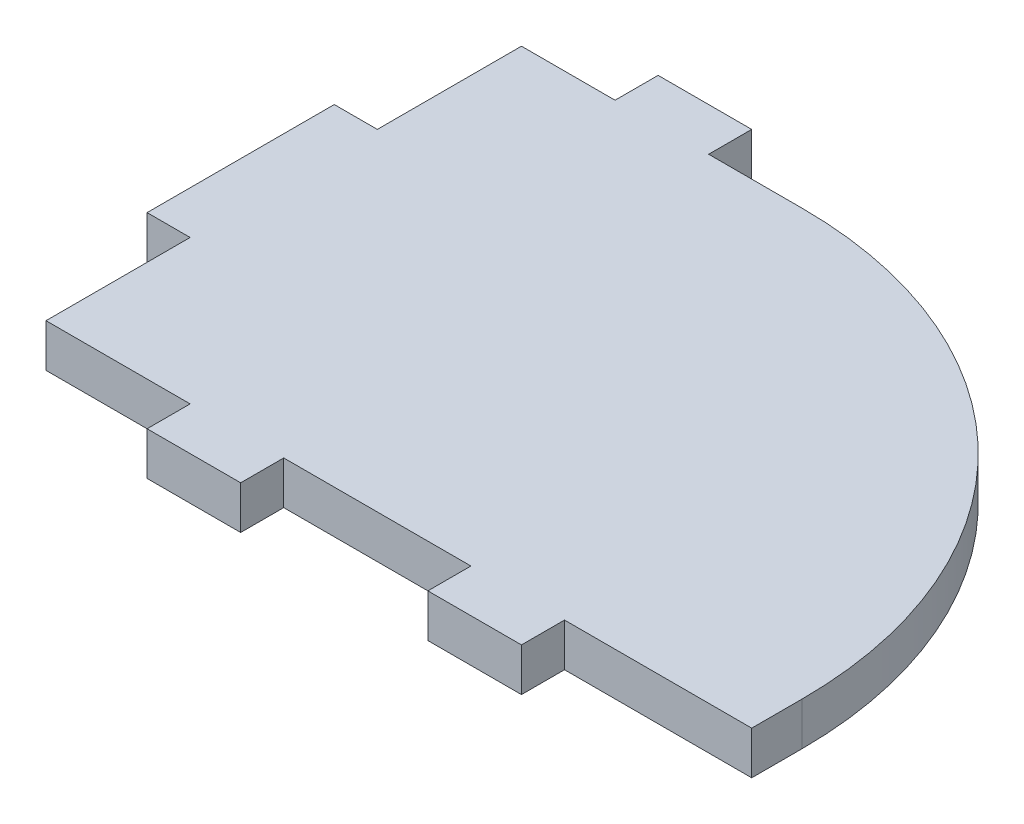
ISO-10303-21;
HEADER;
FILE_DESCRIPTION(('STEP AP214'),'2;1');
FILE_NAME('part.step','',(''),(''),'','','');
FILE_SCHEMA(('AUTOMOTIVE_DESIGN { 1 0 10303 214 1 1 1 1 }'));
ENDSEC;
DATA;
#1=APPLICATION_CONTEXT('core data for automotive mechanical design processes');
#2=APPLICATION_PROTOCOL_DEFINITION('international standard','automotive_design',2000,#1);
#3=PRODUCT_CONTEXT('',#1,'mechanical');
#4=PRODUCT('Part','Part','',(#3));
#5=PRODUCT_RELATED_PRODUCT_CATEGORY('part','',(#4));
#6=PRODUCT_DEFINITION_FORMATION('','',#4);
#7=PRODUCT_DEFINITION_CONTEXT('part definition',#1,'design');
#8=PRODUCT_DEFINITION('design','',#6,#7);
#9=PRODUCT_DEFINITION_SHAPE('','',#8);
#10=(LENGTH_UNIT() NAMED_UNIT(*) SI_UNIT(.MILLI.,.METRE.));
#11=(NAMED_UNIT(*) PLANE_ANGLE_UNIT() SI_UNIT($,.RADIAN.));
#12=(NAMED_UNIT(*) SI_UNIT($,.STERADIAN.) SOLID_ANGLE_UNIT());
#13=UNCERTAINTY_MEASURE_WITH_UNIT(LENGTH_MEASURE(1.E-05),#10,'distance_accuracy_value','');
#14=(GEOMETRIC_REPRESENTATION_CONTEXT(3) GLOBAL_UNCERTAINTY_ASSIGNED_CONTEXT((#13)) GLOBAL_UNIT_ASSIGNED_CONTEXT((#10,
#11,#12)) REPRESENTATION_CONTEXT('',''));
#15=CARTESIAN_POINT('',(0.,0.,0.));
#16=DIRECTION('',(0.,0.,1.));
#17=DIRECTION('',(1.,0.,0.));
#18=AXIS2_PLACEMENT_3D('',#15,#16,#17);
#19=CARTESIAN_POINT('',(50.8,2.921,0.));
#20=DIRECTION('',(-1.,0.,0.));
#21=DIRECTION('',(0.,0.,1.));
#22=AXIS2_PLACEMENT_3D('',#19,#20,#21);
#23=PLANE('',#22);
#24=DIRECTION('',(0.,1.,0.));
#25=VECTOR('',#24,1.);
#26=CARTESIAN_POINT('',(50.8,0.,-6.35));
#27=LINE('',#26,#25);
#28=CARTESIAN_POINT('',(50.8,0.,-6.35));
#29=VERTEX_POINT('',#28);
#30=CARTESIAN_POINT('',(50.8,2.921,-6.35));
#31=VERTEX_POINT('',#30);
#32=EDGE_CURVE('E184',#29,#31,#27,.T.);
#33=ORIENTED_EDGE('',*,*,#32,.T.);
#34=DIRECTION('',(0.,0.,-1.));
#35=VECTOR('',#34,1.);
#36=CARTESIAN_POINT('',(50.8,2.921,0.));
#37=LINE('',#36,#35);
#38=CARTESIAN_POINT('',(50.8,2.921,-2.921));
#39=VERTEX_POINT('',#38);
#40=EDGE_CURVE('E269',#39,#31,#37,.T.);
#41=ORIENTED_EDGE('',*,*,#40,.F.);
#42=DIRECTION('',(0.,1.,0.));
#43=VECTOR('',#42,1.);
#44=CARTESIAN_POINT('',(50.8,0.,-2.921));
#45=LINE('',#44,#43);
#46=CARTESIAN_POINT('',(50.8,0.,-2.921));
#47=VERTEX_POINT('',#46);
#48=EDGE_CURVE('E206',#47,#39,#45,.T.);
#49=ORIENTED_EDGE('',*,*,#48,.F.);
#50=DIRECTION('',(0.,0.,-1.));
#51=VECTOR('',#50,1.);
#52=CARTESIAN_POINT('',(50.8,0.,0.));
#53=LINE('',#52,#51);
#54=EDGE_CURVE('E201',#47,#29,#53,.T.);
#55=ORIENTED_EDGE('',*,*,#54,.T.);
#56=EDGE_LOOP('',(#33,#41,#49,#55));
#57=FACE_BOUND('',#56,.T.);
#58=ADVANCED_FACE('F41',(#57),#23,.F.);
#59=CARTESIAN_POINT('',(0.,2.921,0.));
#60=DIRECTION('',(0.,0.,-1.));
#61=DIRECTION('',(-1.,0.,0.));
#62=AXIS2_PLACEMENT_3D('',#59,#60,#61);
#63=PLANE('',#62);
#64=DIRECTION('',(1.,0.,0.));
#65=VECTOR('',#64,1.);
#66=CARTESIAN_POINT('',(0.,2.921,0.));
#67=LINE('',#66,#65);
#68=CARTESIAN_POINT('',(12.7,2.921,0.));
#69=VERTEX_POINT('',#68);
#70=CARTESIAN_POINT('',(19.05,2.921,0.));
#71=VERTEX_POINT('',#70);
#72=EDGE_CURVE('E221',#69,#71,#67,.T.);
#73=ORIENTED_EDGE('',*,*,#72,.F.);
#74=DIRECTION('',(0.,-1.,0.));
#75=VECTOR('',#74,1.);
#76=CARTESIAN_POINT('',(12.7,2.921,0.));
#77=LINE('',#76,#75);
#78=CARTESIAN_POINT('',(12.7,0.,0.));
#79=VERTEX_POINT('',#78);
#80=EDGE_CURVE('E327',#69,#79,#77,.T.);
#81=ORIENTED_EDGE('',*,*,#80,.T.);
#82=DIRECTION('',(1.,0.,0.));
#83=VECTOR('',#82,1.);
#84=CARTESIAN_POINT('',(0.,0.,0.));
#85=LINE('',#84,#83);
#86=CARTESIAN_POINT('',(19.05,0.,0.));
#87=VERTEX_POINT('',#86);
#88=EDGE_CURVE('E211',#79,#87,#85,.T.);
#89=ORIENTED_EDGE('',*,*,#88,.T.);
#90=DIRECTION('',(0.,1.,0.));
#91=VECTOR('',#90,1.);
#92=CARTESIAN_POINT('',(19.05,2.921,0.));
#93=LINE('',#92,#91);
#94=EDGE_CURVE('E401',#87,#71,#93,.T.);
#95=ORIENTED_EDGE('',*,*,#94,.T.);
#96=EDGE_LOOP('',(#73,#81,#89,#95));
#97=FACE_BOUND('',#96,.T.);
#98=ADVANCED_FACE('F442',(#97),#63,.F.);
#99=CARTESIAN_POINT('',(0.,2.921,0.));
#100=DIRECTION('',(-1.,0.,0.));
#101=DIRECTION('',(0.,0.,1.));
#102=AXIS2_PLACEMENT_3D('',#99,#100,#101);
#103=PLANE('',#102);
#104=DIRECTION('',(0.,1.,0.));
#105=VECTOR('',#104,1.);
#106=CARTESIAN_POINT('',(0.,2.921,-25.4));
#107=LINE('',#106,#105);
#108=CARTESIAN_POINT('',(0.,0.,-25.4));
#109=VERTEX_POINT('',#108);
#110=CARTESIAN_POINT('',(0.,2.921,-25.4));
#111=VERTEX_POINT('',#110);
#112=EDGE_CURVE('E253',#109,#111,#107,.T.);
#113=ORIENTED_EDGE('',*,*,#112,.F.);
#114=DIRECTION('',(0.,0.,-1.));
#115=VECTOR('',#114,1.);
#116=CARTESIAN_POINT('',(0.,0.,0.));
#117=LINE('',#116,#115);
#118=CARTESIAN_POINT('',(0.,0.,-12.7));
#119=VERTEX_POINT('',#118);
#120=EDGE_CURVE('E214',#119,#109,#117,.T.);
#121=ORIENTED_EDGE('',*,*,#120,.F.);
#122=DIRECTION('',(0.,-1.,0.));
#123=VECTOR('',#122,1.);
#124=CARTESIAN_POINT('',(0.,2.921,-12.7));
#125=LINE('',#124,#123);
#126=CARTESIAN_POINT('',(0.,2.921,-12.7));
#127=VERTEX_POINT('',#126);
#128=EDGE_CURVE('E370',#127,#119,#125,.T.);
#129=ORIENTED_EDGE('',*,*,#128,.F.);
#130=DIRECTION('',(0.,0.,-1.));
#131=VECTOR('',#130,1.);
#132=CARTESIAN_POINT('',(0.,2.921,0.));
#133=LINE('',#132,#131);
#134=EDGE_CURVE('E321',#127,#111,#133,.T.);
#135=ORIENTED_EDGE('',*,*,#134,.T.);
#136=EDGE_LOOP('',(#113,#121,#129,#135));
#137=FACE_BOUND('',#136,.T.);
#138=ADVANCED_FACE('F43',(#137),#103,.T.);
#139=CARTESIAN_POINT('',(31.75,2.921,0.));
#140=VERTEX_POINT('',#139);
#141=CARTESIAN_POINT('',(38.1,2.921,0.));
#142=VERTEX_POINT('',#141);
#143=EDGE_CURVE('E264',#140,#142,#67,.T.);
#144=ORIENTED_EDGE('',*,*,#143,.F.);
#145=DIRECTION('',(0.,-1.,0.));
#146=VECTOR('',#145,1.);
#147=CARTESIAN_POINT('',(31.75,2.921,0.));
#148=LINE('',#147,#146);
#149=CARTESIAN_POINT('',(31.75,0.,0.));
#150=VERTEX_POINT('',#149);
#151=EDGE_CURVE('E400',#140,#150,#148,.T.);
#152=ORIENTED_EDGE('',*,*,#151,.T.);
#153=CARTESIAN_POINT('',(38.1,0.,0.));
#154=VERTEX_POINT('',#153);
#155=EDGE_CURVE('E207',#150,#154,#85,.T.);
#156=ORIENTED_EDGE('',*,*,#155,.T.);
#157=DIRECTION('',(0.,1.,0.));
#158=VECTOR('',#157,1.);
#159=CARTESIAN_POINT('',(38.1,2.921,0.));
#160=LINE('',#159,#158);
#161=EDGE_CURVE('E397',#154,#142,#160,.T.);
#162=ORIENTED_EDGE('',*,*,#161,.T.);
#163=EDGE_LOOP('',(#144,#152,#156,#162));
#164=FACE_BOUND('',#163,.T.);
#165=ADVANCED_FACE('F448',(#164),#63,.F.);
#166=CARTESIAN_POINT('',(0.,2.921,-38.1));
#167=DIRECTION('',(0.,0.,-1.));
#168=DIRECTION('',(-1.,0.,0.));
#169=AXIS2_PLACEMENT_3D('',#166,#167,#168);
#170=PLANE('',#169);
#171=DIRECTION('',(0.,1.,0.));
#172=VECTOR('',#171,1.);
#173=CARTESIAN_POINT('',(15.621,2.921,-38.1));
#174=LINE('',#173,#172);
#175=CARTESIAN_POINT('',(15.621,0.,-38.1));
#176=VERTEX_POINT('',#175);
#177=CARTESIAN_POINT('',(15.621,2.921,-38.1));
#178=VERTEX_POINT('',#177);
#179=EDGE_CURVE('E355',#176,#178,#174,.T.);
#180=ORIENTED_EDGE('',*,*,#179,.F.);
#181=DIRECTION('',(1.,0.,0.));
#182=VECTOR('',#181,1.);
#183=CARTESIAN_POINT('',(0.,0.,-38.1));
#184=LINE('',#183,#182);
#185=CARTESIAN_POINT('',(9.271,0.,-38.1));
#186=VERTEX_POINT('',#185);
#187=EDGE_CURVE('E208',#186,#176,#184,.T.);
#188=ORIENTED_EDGE('',*,*,#187,.F.);
#189=DIRECTION('',(0.,-1.,0.));
#190=VECTOR('',#189,1.);
#191=CARTESIAN_POINT('',(9.271,2.921,-38.1));
#192=LINE('',#191,#190);
#193=CARTESIAN_POINT('',(9.271,2.921,-38.1));
#194=VERTEX_POINT('',#193);
#195=EDGE_CURVE('E194',#194,#186,#192,.T.);
#196=ORIENTED_EDGE('',*,*,#195,.F.);
#197=DIRECTION('',(1.,0.,0.));
#198=VECTOR('',#197,1.);
#199=CARTESIAN_POINT('',(0.,2.921,-38.1));
#200=LINE('',#199,#198);
#201=EDGE_CURVE('E326',#194,#178,#200,.T.);
#202=ORIENTED_EDGE('',*,*,#201,.T.);
#203=EDGE_LOOP('',(#180,#188,#196,#202));
#204=FACE_BOUND('',#203,.T.);
#205=ADVANCED_FACE('F450',(#204),#170,.T.);
#206=CARTESIAN_POINT('',(0.,2.921,0.));
#207=DIRECTION('',(0.,-1.,0.));
#208=DIRECTION('',(0.,0.,-1.));
#209=AXIS2_PLACEMENT_3D('',#206,#207,#208);
#210=PLANE('',#209);
#211=ORIENTED_EDGE('',*,*,#40,.T.);
#212=CARTESIAN_POINT('',(21.971,2.921,-6.34999999999999));
#213=DIRECTION('',(0.,-1.,0.));
#214=DIRECTION('',(0.,0.,-1.));
#215=AXIS2_PLACEMENT_3D('',#212,#213,#214);
#216=CIRCLE('',#215,28.829);
#217=CARTESIAN_POINT('',(21.971,2.921,-35.179));
#218=VERTEX_POINT('',#217);
#219=EDGE_CURVE('E189',#218,#31,#216,.T.);
#220=ORIENTED_EDGE('',*,*,#219,.F.);
#221=DIRECTION('',(1.,0.,0.));
#222=VECTOR('',#221,1.);
#223=CARTESIAN_POINT('',(15.621,2.921,-35.179));
#224=LINE('',#223,#222);
#225=CARTESIAN_POINT('',(15.621,2.921,-35.179));
#226=VERTEX_POINT('',#225);
#227=EDGE_CURVE('E477',#226,#218,#224,.T.);
#228=ORIENTED_EDGE('',*,*,#227,.F.);
#229=DIRECTION('',(0.,0.,1.));
#230=VECTOR('',#229,1.);
#231=CARTESIAN_POINT('',(15.621,2.921,-42.5172954626565));
#232=LINE('',#231,#230);
#233=EDGE_CURVE('E342',#178,#226,#232,.T.);
#234=ORIENTED_EDGE('',*,*,#233,.F.);
#235=ORIENTED_EDGE('',*,*,#201,.F.);
#236=DIRECTION('',(0.,0.,-1.));
#237=VECTOR('',#236,1.);
#238=CARTESIAN_POINT('',(9.271,2.921,-35.179));
#239=LINE('',#238,#237);
#240=CARTESIAN_POINT('',(9.271,2.921,-35.179));
#241=VERTEX_POINT('',#240);
#242=EDGE_CURVE('E339',#241,#194,#239,.T.);
#243=ORIENTED_EDGE('',*,*,#242,.F.);
#244=DIRECTION('',(1.,0.,0.));
#245=VECTOR('',#244,1.);
#246=CARTESIAN_POINT('',(-6.07184644318901,2.921,-35.179));
#247=LINE('',#246,#245);
#248=CARTESIAN_POINT('',(2.921,2.921,-35.179));
#249=VERTEX_POINT('',#248);
#250=EDGE_CURVE('E203',#249,#241,#247,.T.);
#251=ORIENTED_EDGE('',*,*,#250,.F.);
#252=DIRECTION('',(0.,0.,-1.));
#253=VECTOR('',#252,1.);
#254=CARTESIAN_POINT('',(2.921,2.921,-38.1));
#255=LINE('',#254,#253);
#256=CARTESIAN_POINT('',(2.921,2.921,-25.4));
#257=VERTEX_POINT('',#256);
#258=EDGE_CURVE('E304',#257,#249,#255,.T.);
#259=ORIENTED_EDGE('',*,*,#258,.F.);
#260=DIRECTION('',(1.,0.,0.));
#261=VECTOR('',#260,1.);
#262=CARTESIAN_POINT('',(2.921,2.921,-25.4));
#263=LINE('',#262,#261);
#264=EDGE_CURVE('E310',#111,#257,#263,.T.);
#265=ORIENTED_EDGE('',*,*,#264,.F.);
#266=ORIENTED_EDGE('',*,*,#134,.F.);
#267=DIRECTION('',(-1.,0.,0.));
#268=VECTOR('',#267,1.);
#269=CARTESIAN_POINT('',(-4.31094218975035,2.921,-12.7));
#270=LINE('',#269,#268);
#271=CARTESIAN_POINT('',(2.921,2.921,-12.7));
#272=VERTEX_POINT('',#271);
#273=EDGE_CURVE('E303',#272,#127,#270,.T.);
#274=ORIENTED_EDGE('',*,*,#273,.F.);
#275=DIRECTION('',(0.,0.,-1.));
#276=VECTOR('',#275,1.);
#277=CARTESIAN_POINT('',(2.921,2.921,-12.7));
#278=LINE('',#277,#276);
#279=CARTESIAN_POINT('',(2.921,2.921,-2.921));
#280=VERTEX_POINT('',#279);
#281=EDGE_CURVE('E299',#280,#272,#278,.T.);
#282=ORIENTED_EDGE('',*,*,#281,.F.);
#283=DIRECTION('',(-1.,0.,0.));
#284=VECTOR('',#283,1.);
#285=CARTESIAN_POINT('',(12.7,2.921,-2.921));
#286=LINE('',#285,#284);
#287=CARTESIAN_POINT('',(12.7,2.921,-2.921));
#288=VERTEX_POINT('',#287);
#289=EDGE_CURVE('E231',#288,#280,#286,.T.);
#290=ORIENTED_EDGE('',*,*,#289,.F.);
#291=DIRECTION('',(0.,0.,-1.));
#292=VECTOR('',#291,1.);
#293=CARTESIAN_POINT('',(12.7,2.921,5.98615624312504));
#294=LINE('',#293,#292);
#295=EDGE_CURVE('E282',#69,#288,#294,.T.);
#296=ORIENTED_EDGE('',*,*,#295,.F.);
#297=ORIENTED_EDGE('',*,*,#72,.T.);
#298=DIRECTION('',(0.,0.,1.));
#299=VECTOR('',#298,1.);
#300=CARTESIAN_POINT('',(19.05,2.921,-2.921));
#301=LINE('',#300,#299);
#302=CARTESIAN_POINT('',(19.05,2.921,-2.921));
#303=VERTEX_POINT('',#302);
#304=EDGE_CURVE('E279',#303,#71,#301,.T.);
#305=ORIENTED_EDGE('',*,*,#304,.F.);
#306=DIRECTION('',(-1.,0.,0.));
#307=VECTOR('',#306,1.);
#308=CARTESIAN_POINT('',(31.75,2.921,-2.921));
#309=LINE('',#308,#307);
#310=CARTESIAN_POINT('',(31.75,2.921,-2.921));
#311=VERTEX_POINT('',#310);
#312=EDGE_CURVE('E283',#311,#303,#309,.T.);
#313=ORIENTED_EDGE('',*,*,#312,.F.);
#314=DIRECTION('',(0.,0.,-1.));
#315=VECTOR('',#314,1.);
#316=CARTESIAN_POINT('',(31.75,2.921,7.01465810854311));
#317=LINE('',#316,#315);
#318=EDGE_CURVE('E257',#140,#311,#317,.T.);
#319=ORIENTED_EDGE('',*,*,#318,.F.);
#320=ORIENTED_EDGE('',*,*,#143,.T.);
#321=DIRECTION('',(0.,0.,1.));
#322=VECTOR('',#321,1.);
#323=CARTESIAN_POINT('',(38.1,2.921,-2.921));
#324=LINE('',#323,#322);
#325=CARTESIAN_POINT('',(38.1,2.921,-2.921));
#326=VERTEX_POINT('',#325);
#327=EDGE_CURVE('E252',#326,#142,#324,.T.);
#328=ORIENTED_EDGE('',*,*,#327,.F.);
#329=DIRECTION('',(-1.,0.,0.));
#330=VECTOR('',#329,1.);
#331=CARTESIAN_POINT('',(50.8,2.921,-2.921));
#332=LINE('',#331,#330);
#333=EDGE_CURVE('E247',#39,#326,#332,.T.);
#334=ORIENTED_EDGE('',*,*,#333,.F.);
#335=EDGE_LOOP('',(#211,#220,#228,#234,#235,#243,#251,#259,#265,#266,#274,#282,#290,#296,#297,
#305,#313,#319,#320,#328,#334));
#336=FACE_BOUND('',#335,.T.);
#337=ADVANCED_FACE('F418',(#336),#210,.F.);
#338=CARTESIAN_POINT('',(0.,0.,0.));
#339=DIRECTION('',(0.,-1.,0.));
#340=DIRECTION('',(0.,0.,-1.));
#341=AXIS2_PLACEMENT_3D('',#338,#339,#340);
#342=PLANE('',#341);
#343=CARTESIAN_POINT('',(21.971,0.,-6.34999999999999));
#344=DIRECTION('',(0.,-1.,0.));
#345=DIRECTION('',(0.,0.,-1.));
#346=AXIS2_PLACEMENT_3D('',#343,#344,#345);
#347=CIRCLE('',#346,28.829);
#348=CARTESIAN_POINT('',(21.971,0.,-35.179));
#349=VERTEX_POINT('',#348);
#350=EDGE_CURVE('E187',#349,#29,#347,.T.);
#351=ORIENTED_EDGE('',*,*,#350,.T.);
#352=ORIENTED_EDGE('',*,*,#54,.F.);
#353=DIRECTION('',(-1.,0.,0.));
#354=VECTOR('',#353,1.);
#355=CARTESIAN_POINT('',(50.8,0.,-2.921));
#356=LINE('',#355,#354);
#357=CARTESIAN_POINT('',(38.1,0.,-2.921));
#358=VERTEX_POINT('',#357);
#359=EDGE_CURVE('E291',#47,#358,#356,.T.);
#360=ORIENTED_EDGE('',*,*,#359,.T.);
#361=DIRECTION('',(0.,0.,1.));
#362=VECTOR('',#361,1.);
#363=CARTESIAN_POINT('',(38.1,0.,-2.921));
#364=LINE('',#363,#362);
#365=EDGE_CURVE('E375',#358,#154,#364,.T.);
#366=ORIENTED_EDGE('',*,*,#365,.T.);
#367=ORIENTED_EDGE('',*,*,#155,.F.);
#368=DIRECTION('',(0.,0.,1.));
#369=VECTOR('',#368,1.);
#370=CARTESIAN_POINT('',(31.75,0.,0.));
#371=LINE('',#370,#369);
#372=CARTESIAN_POINT('',(31.75,0.,-2.921));
#373=VERTEX_POINT('',#372);
#374=EDGE_CURVE('E218',#373,#150,#371,.T.);
#375=ORIENTED_EDGE('',*,*,#374,.F.);
#376=DIRECTION('',(-1.,0.,0.));
#377=VECTOR('',#376,1.);
#378=CARTESIAN_POINT('',(31.75,0.,-2.921));
#379=LINE('',#378,#377);
#380=CARTESIAN_POINT('',(19.05,0.,-2.921));
#381=VERTEX_POINT('',#380);
#382=EDGE_CURVE('E244',#373,#381,#379,.T.);
#383=ORIENTED_EDGE('',*,*,#382,.T.);
#384=DIRECTION('',(0.,0.,1.));
#385=VECTOR('',#384,1.);
#386=CARTESIAN_POINT('',(19.05,0.,-2.921));
#387=LINE('',#386,#385);
#388=EDGE_CURVE('E239',#381,#87,#387,.T.);
#389=ORIENTED_EDGE('',*,*,#388,.T.);
#390=ORIENTED_EDGE('',*,*,#88,.F.);
#391=DIRECTION('',(0.,0.,1.));
#392=VECTOR('',#391,1.);
#393=CARTESIAN_POINT('',(12.7,0.,0.));
#394=LINE('',#393,#392);
#395=CARTESIAN_POINT('',(12.7,0.,-2.921));
#396=VERTEX_POINT('',#395);
#397=EDGE_CURVE('E220',#396,#79,#394,.T.);
#398=ORIENTED_EDGE('',*,*,#397,.F.);
#399=DIRECTION('',(-1.,0.,0.));
#400=VECTOR('',#399,1.);
#401=CARTESIAN_POINT('',(12.7,0.,-2.921));
#402=LINE('',#401,#400);
#403=CARTESIAN_POINT('',(2.921,0.,-2.921));
#404=VERTEX_POINT('',#403);
#405=EDGE_CURVE('E228',#396,#404,#402,.T.);
#406=ORIENTED_EDGE('',*,*,#405,.T.);
#407=DIRECTION('',(0.,0.,-1.));
#408=VECTOR('',#407,1.);
#409=CARTESIAN_POINT('',(2.921,0.,-12.7));
#410=LINE('',#409,#408);
#411=CARTESIAN_POINT('',(2.921,0.,-12.7));
#412=VERTEX_POINT('',#411);
#413=EDGE_CURVE('E237',#404,#412,#410,.T.);
#414=ORIENTED_EDGE('',*,*,#413,.T.);
#415=DIRECTION('',(-1.,0.,0.));
#416=VECTOR('',#415,1.);
#417=CARTESIAN_POINT('',(-4.31094218975035,0.,-12.7));
#418=LINE('',#417,#416);
#419=EDGE_CURVE('E360',#412,#119,#418,.T.);
#420=ORIENTED_EDGE('',*,*,#419,.T.);
#421=ORIENTED_EDGE('',*,*,#120,.T.);
#422=DIRECTION('',(1.,0.,0.));
#423=VECTOR('',#422,1.);
#424=CARTESIAN_POINT('',(2.921,0.,-25.4));
#425=LINE('',#424,#423);
#426=CARTESIAN_POINT('',(2.921,0.,-25.4));
#427=VERTEX_POINT('',#426);
#428=EDGE_CURVE('E361',#109,#427,#425,.T.);
#429=ORIENTED_EDGE('',*,*,#428,.T.);
#430=DIRECTION('',(0.,0.,-1.));
#431=VECTOR('',#430,1.);
#432=CARTESIAN_POINT('',(2.921,0.,-38.1));
#433=LINE('',#432,#431);
#434=CARTESIAN_POINT('',(2.921,0.,-35.179));
#435=VERTEX_POINT('',#434);
#436=EDGE_CURVE('E314',#427,#435,#433,.T.);
#437=ORIENTED_EDGE('',*,*,#436,.T.);
#438=DIRECTION('',(1.,0.,0.));
#439=VECTOR('',#438,1.);
#440=CARTESIAN_POINT('',(-6.07184644318901,0.,-35.179));
#441=LINE('',#440,#439);
#442=CARTESIAN_POINT('',(9.271,0.,-35.179));
#443=VERTEX_POINT('',#442);
#444=EDGE_CURVE('E64',#435,#443,#441,.T.);
#445=ORIENTED_EDGE('',*,*,#444,.T.);
#446=DIRECTION('',(0.,0.,-1.));
#447=VECTOR('',#446,1.);
#448=CARTESIAN_POINT('',(9.271,0.,-35.179));
#449=LINE('',#448,#447);
#450=EDGE_CURVE('E468',#443,#186,#449,.T.);
#451=ORIENTED_EDGE('',*,*,#450,.T.);
#452=ORIENTED_EDGE('',*,*,#187,.T.);
#453=DIRECTION('',(0.,0.,1.));
#454=VECTOR('',#453,1.);
#455=CARTESIAN_POINT('',(15.621,0.,-42.5172954626565));
#456=LINE('',#455,#454);
#457=CARTESIAN_POINT('',(15.621,0.,-35.179));
#458=VERTEX_POINT('',#457);
#459=EDGE_CURVE('E466',#176,#458,#456,.T.);
#460=ORIENTED_EDGE('',*,*,#459,.T.);
#461=DIRECTION('',(1.,0.,0.));
#462=VECTOR('',#461,1.);
#463=CARTESIAN_POINT('',(15.621,0.,-35.179));
#464=LINE('',#463,#462);
#465=EDGE_CURVE('E56',#458,#349,#464,.T.);
#466=ORIENTED_EDGE('',*,*,#465,.T.);
#467=EDGE_LOOP('',(#351,#352,#360,#366,#367,#375,#383,#389,#390,#398,#406,#414,#420,#421,#429,
#437,#445,#451,#452,#460,#466));
#468=FACE_BOUND('',#467,.T.);
#469=ADVANCED_FACE('F199',(#468),#342,.T.);
#470=CARTESIAN_POINT('',(50.8,0.,-2.921));
#471=DIRECTION('',(0.,0.,-1.));
#472=DIRECTION('',(-1.,0.,0.));
#473=AXIS2_PLACEMENT_3D('',#470,#471,#472);
#474=PLANE('',#473);
#475=ORIENTED_EDGE('',*,*,#333,.T.);
#476=DIRECTION('',(0.,1.,0.));
#477=VECTOR('',#476,1.);
#478=CARTESIAN_POINT('',(38.1,0.,-2.921));
#479=LINE('',#478,#477);
#480=EDGE_CURVE('E241',#358,#326,#479,.T.);
#481=ORIENTED_EDGE('',*,*,#480,.F.);
#482=ORIENTED_EDGE('',*,*,#359,.F.);
#483=ORIENTED_EDGE('',*,*,#48,.T.);
#484=EDGE_LOOP('',(#475,#481,#482,#483));
#485=FACE_BOUND('',#484,.T.);
#486=ADVANCED_FACE('F492',(#485),#474,.F.);
#487=CARTESIAN_POINT('',(38.1,0.,-2.921));
#488=DIRECTION('',(-1.,0.,0.));
#489=DIRECTION('',(0.,0.,1.));
#490=AXIS2_PLACEMENT_3D('',#487,#488,#489);
#491=PLANE('',#490);
#492=ORIENTED_EDGE('',*,*,#365,.F.);
#493=ORIENTED_EDGE('',*,*,#480,.T.);
#494=ORIENTED_EDGE('',*,*,#327,.T.);
#495=ORIENTED_EDGE('',*,*,#161,.F.);
#496=EDGE_LOOP('',(#492,#493,#494,#495));
#497=FACE_BOUND('',#496,.T.);
#498=ADVANCED_FACE('F495',(#497),#491,.F.);
#499=CARTESIAN_POINT('',(31.75,0.,7.01465810854311));
#500=DIRECTION('',(1.,0.,0.));
#501=DIRECTION('',(0.,0.,-1.));
#502=AXIS2_PLACEMENT_3D('',#499,#500,#501);
#503=PLANE('',#502);
#504=ORIENTED_EDGE('',*,*,#318,.T.);
#505=DIRECTION('',(0.,1.,0.));
#506=VECTOR('',#505,1.);
#507=CARTESIAN_POINT('',(31.75,0.,-2.921));
#508=LINE('',#507,#506);
#509=EDGE_CURVE('E387',#373,#311,#508,.T.);
#510=ORIENTED_EDGE('',*,*,#509,.F.);
#511=ORIENTED_EDGE('',*,*,#374,.T.);
#512=ORIENTED_EDGE('',*,*,#151,.F.);
#513=EDGE_LOOP('',(#504,#510,#511,#512));
#514=FACE_BOUND('',#513,.T.);
#515=ADVANCED_FACE('F391',(#514),#503,.F.);
#516=CARTESIAN_POINT('',(31.75,0.,-2.921));
#517=DIRECTION('',(0.,0.,-1.));
#518=DIRECTION('',(-1.,0.,0.));
#519=AXIS2_PLACEMENT_3D('',#516,#517,#518);
#520=PLANE('',#519);
#521=ORIENTED_EDGE('',*,*,#312,.T.);
#522=DIRECTION('',(0.,1.,0.));
#523=VECTOR('',#522,1.);
#524=CARTESIAN_POINT('',(19.05,0.,-2.921));
#525=LINE('',#524,#523);
#526=EDGE_CURVE('E389',#381,#303,#525,.T.);
#527=ORIENTED_EDGE('',*,*,#526,.F.);
#528=ORIENTED_EDGE('',*,*,#382,.F.);
#529=ORIENTED_EDGE('',*,*,#509,.T.);
#530=EDGE_LOOP('',(#521,#527,#528,#529));
#531=FACE_BOUND('',#530,.T.);
#532=ADVANCED_FACE('F386',(#531),#520,.F.);
#533=CARTESIAN_POINT('',(19.05,0.,-2.921));
#534=DIRECTION('',(-1.,0.,0.));
#535=DIRECTION('',(0.,0.,1.));
#536=AXIS2_PLACEMENT_3D('',#533,#534,#535);
#537=PLANE('',#536);
#538=ORIENTED_EDGE('',*,*,#388,.F.);
#539=ORIENTED_EDGE('',*,*,#526,.T.);
#540=ORIENTED_EDGE('',*,*,#304,.T.);
#541=ORIENTED_EDGE('',*,*,#94,.F.);
#542=EDGE_LOOP('',(#538,#539,#540,#541));
#543=FACE_BOUND('',#542,.T.);
#544=ADVANCED_FACE('F430',(#543),#537,.F.);
#545=CARTESIAN_POINT('',(12.7,0.,5.98615624312504));
#546=DIRECTION('',(1.,0.,0.));
#547=DIRECTION('',(0.,0.,-1.));
#548=AXIS2_PLACEMENT_3D('',#545,#546,#547);
#549=PLANE('',#548);
#550=ORIENTED_EDGE('',*,*,#295,.T.);
#551=DIRECTION('',(0.,1.,0.));
#552=VECTOR('',#551,1.);
#553=CARTESIAN_POINT('',(12.7,0.,-2.921));
#554=LINE('',#553,#552);
#555=EDGE_CURVE('E292',#396,#288,#554,.T.);
#556=ORIENTED_EDGE('',*,*,#555,.F.);
#557=ORIENTED_EDGE('',*,*,#397,.T.);
#558=ORIENTED_EDGE('',*,*,#80,.F.);
#559=EDGE_LOOP('',(#550,#556,#557,#558));
#560=FACE_BOUND('',#559,.T.);
#561=ADVANCED_FACE('F432',(#560),#549,.F.);
#562=CARTESIAN_POINT('',(12.7,0.,-2.921));
#563=DIRECTION('',(0.,0.,-1.));
#564=DIRECTION('',(-1.,0.,0.));
#565=AXIS2_PLACEMENT_3D('',#562,#563,#564);
#566=PLANE('',#565);
#567=ORIENTED_EDGE('',*,*,#289,.T.);
#568=DIRECTION('',(0.,-1.,0.));
#569=VECTOR('',#568,1.);
#570=CARTESIAN_POINT('',(2.921,0.,-2.921));
#571=LINE('',#570,#569);
#572=EDGE_CURVE('E49',#280,#404,#571,.T.);
#573=ORIENTED_EDGE('',*,*,#572,.T.);
#574=ORIENTED_EDGE('',*,*,#405,.F.);
#575=ORIENTED_EDGE('',*,*,#555,.T.);
#576=EDGE_LOOP('',(#567,#573,#574,#575));
#577=FACE_BOUND('',#576,.T.);
#578=ADVANCED_FACE('F226',(#577),#566,.F.);
#579=CARTESIAN_POINT('',(2.921,0.,-12.7));
#580=DIRECTION('',(1.,0.,0.));
#581=DIRECTION('',(0.,0.,-1.));
#582=AXIS2_PLACEMENT_3D('',#579,#580,#581);
#583=PLANE('',#582);
#584=ORIENTED_EDGE('',*,*,#281,.T.);
#585=DIRECTION('',(0.,1.,0.));
#586=VECTOR('',#585,1.);
#587=CARTESIAN_POINT('',(2.921,0.,-12.7));
#588=LINE('',#587,#586);
#589=EDGE_CURVE('E363',#412,#272,#588,.T.);
#590=ORIENTED_EDGE('',*,*,#589,.F.);
#591=ORIENTED_EDGE('',*,*,#413,.F.);
#592=ORIENTED_EDGE('',*,*,#572,.F.);
#593=EDGE_LOOP('',(#584,#590,#591,#592));
#594=FACE_BOUND('',#593,.T.);
#595=ADVANCED_FACE('F561',(#594),#583,.F.);
#596=CARTESIAN_POINT('',(-4.31094218975035,0.,-12.7));
#597=DIRECTION('',(0.,0.,-1.));
#598=DIRECTION('',(-1.,0.,0.));
#599=AXIS2_PLACEMENT_3D('',#596,#597,#598);
#600=PLANE('',#599);
#601=ORIENTED_EDGE('',*,*,#128,.T.);
#602=ORIENTED_EDGE('',*,*,#419,.F.);
#603=ORIENTED_EDGE('',*,*,#589,.T.);
#604=ORIENTED_EDGE('',*,*,#273,.T.);
#605=EDGE_LOOP('',(#601,#602,#603,#604));
#606=FACE_BOUND('',#605,.T.);
#607=ADVANCED_FACE('F570',(#606),#600,.F.);
#608=CARTESIAN_POINT('',(2.921,0.,-38.1));
#609=DIRECTION('',(1.,0.,0.));
#610=DIRECTION('',(0.,0.,-1.));
#611=AXIS2_PLACEMENT_3D('',#608,#609,#610);
#612=PLANE('',#611);
#613=ORIENTED_EDGE('',*,*,#258,.T.);
#614=DIRECTION('',(0.,-1.,0.));
#615=VECTOR('',#614,1.);
#616=CARTESIAN_POINT('',(2.921,0.,-35.179));
#617=LINE('',#616,#615);
#618=EDGE_CURVE('E13',#249,#435,#617,.T.);
#619=ORIENTED_EDGE('',*,*,#618,.T.);
#620=ORIENTED_EDGE('',*,*,#436,.F.);
#621=DIRECTION('',(0.,1.,0.));
#622=VECTOR('',#621,1.);
#623=CARTESIAN_POINT('',(2.921,0.,-25.4));
#624=LINE('',#623,#622);
#625=EDGE_CURVE('E315',#427,#257,#624,.T.);
#626=ORIENTED_EDGE('',*,*,#625,.T.);
#627=EDGE_LOOP('',(#613,#619,#620,#626));
#628=FACE_BOUND('',#627,.T.);
#629=ADVANCED_FACE('F579',(#628),#612,.F.);
#630=CARTESIAN_POINT('',(2.921,0.,-25.4));
#631=DIRECTION('',(0.,0.,1.));
#632=DIRECTION('',(1.,0.,0.));
#633=AXIS2_PLACEMENT_3D('',#630,#631,#632);
#634=PLANE('',#633);
#635=ORIENTED_EDGE('',*,*,#112,.T.);
#636=ORIENTED_EDGE('',*,*,#264,.T.);
#637=ORIENTED_EDGE('',*,*,#625,.F.);
#638=ORIENTED_EDGE('',*,*,#428,.F.);
#639=EDGE_LOOP('',(#635,#636,#637,#638));
#640=FACE_BOUND('',#639,.T.);
#641=ADVANCED_FACE('F414',(#640),#634,.F.);
#642=CARTESIAN_POINT('',(-6.07184644318901,0.,-35.179));
#643=DIRECTION('',(0.,0.,1.));
#644=DIRECTION('',(1.,0.,0.));
#645=AXIS2_PLACEMENT_3D('',#642,#643,#644);
#646=PLANE('',#645);
#647=ORIENTED_EDGE('',*,*,#250,.T.);
#648=DIRECTION('',(0.,1.,0.));
#649=VECTOR('',#648,1.);
#650=CARTESIAN_POINT('',(9.271,0.,-35.179));
#651=LINE('',#650,#649);
#652=EDGE_CURVE('E348',#443,#241,#651,.T.);
#653=ORIENTED_EDGE('',*,*,#652,.F.);
#654=ORIENTED_EDGE('',*,*,#444,.F.);
#655=ORIENTED_EDGE('',*,*,#618,.F.);
#656=EDGE_LOOP('',(#647,#653,#654,#655));
#657=FACE_BOUND('',#656,.T.);
#658=ADVANCED_FACE('F589',(#657),#646,.F.);
#659=CARTESIAN_POINT('',(9.271,0.,-35.179));
#660=DIRECTION('',(1.,0.,0.));
#661=DIRECTION('',(0.,0.,-1.));
#662=AXIS2_PLACEMENT_3D('',#659,#660,#661);
#663=PLANE('',#662);
#664=ORIENTED_EDGE('',*,*,#195,.T.);
#665=ORIENTED_EDGE('',*,*,#450,.F.);
#666=ORIENTED_EDGE('',*,*,#652,.T.);
#667=ORIENTED_EDGE('',*,*,#242,.T.);
#668=EDGE_LOOP('',(#664,#665,#666,#667));
#669=FACE_BOUND('',#668,.T.);
#670=ADVANCED_FACE('F620',(#669),#663,.F.);
#671=CARTESIAN_POINT('',(21.971,0.,-6.34999999999999));
#672=DIRECTION('',(0.,1.,0.));
#673=DIRECTION('',(0.,0.,1.));
#674=AXIS2_PLACEMENT_3D('',#671,#672,#673);
#675=CYLINDRICAL_SURFACE('',#674,28.829);
#676=ORIENTED_EDGE('',*,*,#219,.T.);
#677=ORIENTED_EDGE('',*,*,#32,.F.);
#678=ORIENTED_EDGE('',*,*,#350,.F.);
#679=DIRECTION('',(0.,1.,0.));
#680=VECTOR('',#679,1.);
#681=CARTESIAN_POINT('',(21.971,0.,-35.179));
#682=LINE('',#681,#680);
#683=EDGE_CURVE('E195',#349,#218,#682,.T.);
#684=ORIENTED_EDGE('',*,*,#683,.T.);
#685=EDGE_LOOP('',(#676,#677,#678,#684));
#686=FACE_BOUND('',#685,.T.);
#687=ADVANCED_FACE('F186',(#686),#675,.T.);
#688=CARTESIAN_POINT('',(15.621,0.,-35.179));
#689=DIRECTION('',(0.,0.,1.));
#690=DIRECTION('',(1.,0.,0.));
#691=AXIS2_PLACEMENT_3D('',#688,#689,#690);
#692=PLANE('',#691);
#693=ORIENTED_EDGE('',*,*,#227,.T.);
#694=ORIENTED_EDGE('',*,*,#683,.F.);
#695=ORIENTED_EDGE('',*,*,#465,.F.);
#696=DIRECTION('',(0.,1.,0.));
#697=VECTOR('',#696,1.);
#698=CARTESIAN_POINT('',(15.621,0.,-35.179));
#699=LINE('',#698,#697);
#700=EDGE_CURVE('E351',#458,#226,#699,.T.);
#701=ORIENTED_EDGE('',*,*,#700,.T.);
#702=EDGE_LOOP('',(#693,#694,#695,#701));
#703=FACE_BOUND('',#702,.T.);
#704=ADVANCED_FACE('F486',(#703),#692,.F.);
#705=CARTESIAN_POINT('',(15.621,0.,-42.5172954626565));
#706=DIRECTION('',(-1.,0.,0.));
#707=DIRECTION('',(0.,0.,1.));
#708=AXIS2_PLACEMENT_3D('',#705,#706,#707);
#709=PLANE('',#708);
#710=ORIENTED_EDGE('',*,*,#179,.T.);
#711=ORIENTED_EDGE('',*,*,#233,.T.);
#712=ORIENTED_EDGE('',*,*,#700,.F.);
#713=ORIENTED_EDGE('',*,*,#459,.F.);
#714=EDGE_LOOP('',(#710,#711,#712,#713));
#715=FACE_BOUND('',#714,.T.);
#716=ADVANCED_FACE('F485',(#715),#709,.F.);
#717=CLOSED_SHELL('',(#58,#98,#138,#165,#205,#337,#469,#486,#498,#515,#532,#544,#561,#578,#595,
#607,#629,#641,#658,#670,#687,#704,#716));
#718=MANIFOLD_SOLID_BREP('B2',#717);
#719=ADVANCED_BREP_SHAPE_REPRESENTATION('',(#18,#718),#14);
#720=SHAPE_DEFINITION_REPRESENTATION(#9,#719);
ENDSEC;
END-ISO-10303-21;
